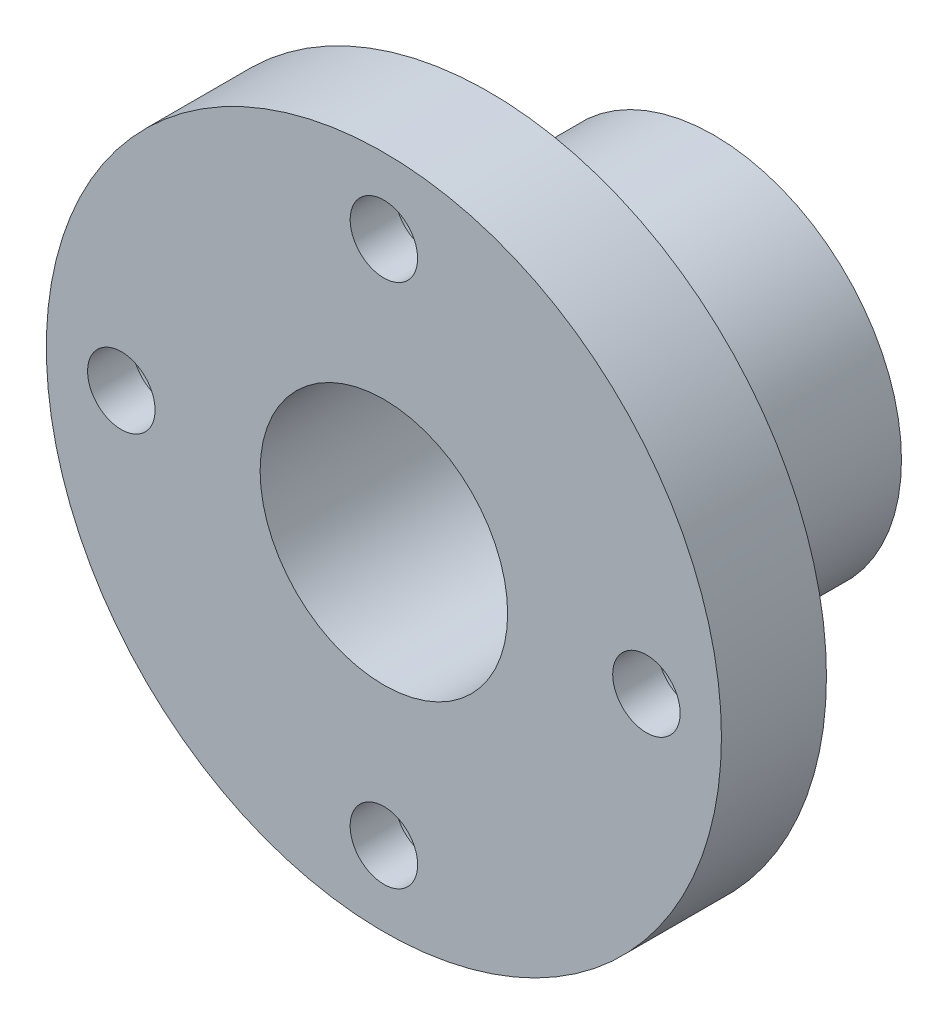
ISO-10303-21;
HEADER;
FILE_DESCRIPTION(('STEP AP214'),'2;1');
FILE_NAME('part.step','',(''),(''),'','','');
FILE_SCHEMA(('AUTOMOTIVE_DESIGN { 1 0 10303 214 1 1 1 1 }'));
ENDSEC;
DATA;
#1=APPLICATION_CONTEXT('core data for automotive mechanical design processes');
#2=APPLICATION_PROTOCOL_DEFINITION('international standard','automotive_design',2000,#1);
#3=PRODUCT_CONTEXT('',#1,'mechanical');
#4=PRODUCT('Part','Part','',(#3));
#5=PRODUCT_RELATED_PRODUCT_CATEGORY('part','',(#4));
#6=PRODUCT_DEFINITION_FORMATION('','',#4);
#7=PRODUCT_DEFINITION_CONTEXT('part definition',#1,'design');
#8=PRODUCT_DEFINITION('design','',#6,#7);
#9=PRODUCT_DEFINITION_SHAPE('','',#8);
#10=(LENGTH_UNIT() NAMED_UNIT(*) SI_UNIT(.MILLI.,.METRE.));
#11=(NAMED_UNIT(*) PLANE_ANGLE_UNIT() SI_UNIT($,.RADIAN.));
#12=(NAMED_UNIT(*) SI_UNIT($,.STERADIAN.) SOLID_ANGLE_UNIT());
#13=UNCERTAINTY_MEASURE_WITH_UNIT(LENGTH_MEASURE(1.E-05),#10,'distance_accuracy_value','');
#14=(GEOMETRIC_REPRESENTATION_CONTEXT(3) GLOBAL_UNCERTAINTY_ASSIGNED_CONTEXT((#13)) GLOBAL_UNIT_ASSIGNED_CONTEXT((#10,
#11,#12)) REPRESENTATION_CONTEXT('',''));
#15=CARTESIAN_POINT('',(0.,0.,0.));
#16=DIRECTION('',(0.,0.,1.));
#17=DIRECTION('',(1.,0.,0.));
#18=AXIS2_PLACEMENT_3D('',#15,#16,#17);
#19=CARTESIAN_POINT('',(0.,0.,15.));
#20=DIRECTION('',(0.,0.,-1.));
#21=DIRECTION('',(-1.,0.,0.));
#22=AXIS2_PLACEMENT_3D('',#19,#20,#21);
#23=CYLINDRICAL_SURFACE('',#22,12.5);
#24=CARTESIAN_POINT('',(0.,0.,15.));
#25=DIRECTION('',(0.,0.,1.));
#26=DIRECTION('',(1.,0.,0.));
#27=AXIS2_PLACEMENT_3D('',#24,#25,#26);
#28=CIRCLE('',#27,12.5);
#29=CARTESIAN_POINT('',(12.5,0.,15.));
#30=VERTEX_POINT('',#29);
#31=EDGE_CURVE('E10',#30,#30,#28,.T.);
#32=ORIENTED_EDGE('',*,*,#31,.F.);
#33=EDGE_LOOP('',(#32));
#34=FACE_BOUND('',#33,.T.);
#35=CARTESIAN_POINT('',(0.,0.,0.));
#36=DIRECTION('',(0.,0.,1.));
#37=DIRECTION('',(1.,0.,0.));
#38=AXIS2_PLACEMENT_3D('',#35,#36,#37);
#39=CIRCLE('',#38,12.5);
#40=CARTESIAN_POINT('',(12.5,0.,0.));
#41=VERTEX_POINT('',#40);
#42=EDGE_CURVE('E41',#41,#41,#39,.T.);
#43=ORIENTED_EDGE('',*,*,#42,.T.);
#44=EDGE_LOOP('',(#43));
#45=FACE_BOUND('',#44,.T.);
#46=ADVANCED_FACE('F34',(#34,#45),#23,.T.);
#47=CARTESIAN_POINT('',(0.,0.,0.));
#48=DIRECTION('',(0.,0.,1.));
#49=DIRECTION('',(1.,0.,0.));
#50=AXIS2_PLACEMENT_3D('',#47,#48,#49);
#51=PLANE('',#50);
#52=CARTESIAN_POINT('',(0.,0.,0.));
#53=DIRECTION('',(0.,0.,-1.));
#54=DIRECTION('',(-1.,0.,0.));
#55=AXIS2_PLACEMENT_3D('',#52,#53,#54);
#56=CIRCLE('',#55,8.25);
#57=CARTESIAN_POINT('',(-8.25,0.,0.));
#58=VERTEX_POINT('',#57);
#59=EDGE_CURVE('E53',#58,#58,#56,.T.);
#60=ORIENTED_EDGE('',*,*,#59,.F.);
#61=EDGE_LOOP('',(#60));
#62=FACE_BOUND('',#61,.T.);
#63=ORIENTED_EDGE('',*,*,#42,.F.);
#64=EDGE_LOOP('',(#63));
#65=FACE_BOUND('',#64,.T.);
#66=ADVANCED_FACE('F123',(#62,#65),#51,.F.);
#67=CARTESIAN_POINT('',(0.,0.,15.));
#68=DIRECTION('',(0.,0.,1.));
#69=DIRECTION('',(1.,0.,0.));
#70=AXIS2_PLACEMENT_3D('',#67,#68,#69);
#71=PLANE('',#70);
#72=CARTESIAN_POINT('',(-17.5,1.83302876458243E-13,15.));
#73=DIRECTION('',(0.,0.,-1.));
#74=DIRECTION('',(-1.,0.,0.));
#75=AXIS2_PLACEMENT_3D('',#72,#73,#74);
#76=CIRCLE('',#75,4.025);
#77=CARTESIAN_POINT('',(-21.525,1.83302876458243E-13,15.));
#78=VERTEX_POINT('',#77);
#79=EDGE_CURVE('E113',#78,#78,#76,.T.);
#80=ORIENTED_EDGE('',*,*,#79,.F.);
#81=EDGE_LOOP('',(#80));
#82=FACE_BOUND('',#81,.T.);
#83=CARTESIAN_POINT('',(-1.22201917638828E-13,-17.5,15.));
#84=DIRECTION('',(0.,0.,-1.));
#85=DIRECTION('',(-1.,0.,0.));
#86=AXIS2_PLACEMENT_3D('',#83,#84,#85);
#87=CIRCLE('',#86,4.025);
#88=CARTESIAN_POINT('',(-4.02500000000012,-17.5,15.));
#89=VERTEX_POINT('',#88);
#90=EDGE_CURVE('E98',#89,#89,#87,.T.);
#91=ORIENTED_EDGE('',*,*,#90,.F.);
#92=EDGE_LOOP('',(#91));
#93=FACE_BOUND('',#92,.T.);
#94=CARTESIAN_POINT('',(17.5,0.,15.));
#95=DIRECTION('',(0.,0.,-1.));
#96=DIRECTION('',(-1.,0.,0.));
#97=AXIS2_PLACEMENT_3D('',#94,#95,#96);
#98=CIRCLE('',#97,4.025);
#99=CARTESIAN_POINT('',(13.475,0.,15.));
#100=VERTEX_POINT('',#99);
#101=EDGE_CURVE('E83',#100,#100,#98,.T.);
#102=ORIENTED_EDGE('',*,*,#101,.F.);
#103=EDGE_LOOP('',(#102));
#104=FACE_BOUND('',#103,.T.);
#105=CARTESIAN_POINT('',(0.,17.5,15.));
#106=DIRECTION('',(0.,0.,-1.));
#107=DIRECTION('',(-1.,0.,0.));
#108=AXIS2_PLACEMENT_3D('',#105,#106,#107);
#109=CIRCLE('',#108,4.025);
#110=CARTESIAN_POINT('',(-4.025,17.5,15.));
#111=VERTEX_POINT('',#110);
#112=EDGE_CURVE('E68',#111,#111,#109,.T.);
#113=ORIENTED_EDGE('',*,*,#112,.F.);
#114=EDGE_LOOP('',(#113));
#115=FACE_BOUND('',#114,.T.);
#116=CARTESIAN_POINT('',(0.,0.,15.));
#117=DIRECTION('',(0.,0.,1.));
#118=DIRECTION('',(1.,0.,0.));
#119=AXIS2_PLACEMENT_3D('',#116,#117,#118);
#120=CIRCLE('',#119,22.5);
#121=CARTESIAN_POINT('',(22.5,0.,15.));
#122=VERTEX_POINT('',#121);
#123=EDGE_CURVE('E48',#122,#122,#120,.T.);
#124=ORIENTED_EDGE('',*,*,#123,.F.);
#125=EDGE_LOOP('',(#124));
#126=FACE_BOUND('',#125,.T.);
#127=ORIENTED_EDGE('',*,*,#31,.T.);
#128=EDGE_LOOP('',(#127));
#129=FACE_BOUND('',#128,.T.);
#130=ADVANCED_FACE('F119',(#82,#93,#104,#115,#126,#129),#71,.F.);
#131=CARTESIAN_POINT('',(0.,0.,22.));
#132=DIRECTION('',(0.,0.,-1.));
#133=DIRECTION('',(-1.,0.,0.));
#134=AXIS2_PLACEMENT_3D('',#131,#132,#133);
#135=CYLINDRICAL_SURFACE('',#134,22.5);
#136=CARTESIAN_POINT('',(0.,0.,22.));
#137=DIRECTION('',(0.,0.,1.));
#138=DIRECTION('',(1.,0.,0.));
#139=AXIS2_PLACEMENT_3D('',#136,#137,#138);
#140=CIRCLE('',#139,22.5);
#141=CARTESIAN_POINT('',(22.5,0.,22.));
#142=VERTEX_POINT('',#141);
#143=EDGE_CURVE('E46',#142,#142,#140,.T.);
#144=ORIENTED_EDGE('',*,*,#143,.F.);
#145=EDGE_LOOP('',(#144));
#146=FACE_BOUND('',#145,.T.);
#147=ORIENTED_EDGE('',*,*,#123,.T.);
#148=EDGE_LOOP('',(#147));
#149=FACE_BOUND('',#148,.T.);
#150=ADVANCED_FACE('F122',(#146,#149),#135,.T.);
#151=CARTESIAN_POINT('',(0.,0.,22.));
#152=DIRECTION('',(0.,0.,1.));
#153=DIRECTION('',(1.,0.,0.));
#154=AXIS2_PLACEMENT_3D('',#151,#152,#153);
#155=PLANE('',#154);
#156=CARTESIAN_POINT('',(-17.5,1.83302876458243E-13,22.));
#157=DIRECTION('',(0.,0.,-1.));
#158=DIRECTION('',(-1.,0.,0.));
#159=AXIS2_PLACEMENT_3D('',#156,#157,#158);
#160=CIRCLE('',#159,2.25);
#161=CARTESIAN_POINT('',(-19.75,1.83302876458243E-13,22.));
#162=VERTEX_POINT('',#161);
#163=EDGE_CURVE('E101',#162,#162,#160,.T.);
#164=ORIENTED_EDGE('',*,*,#163,.T.);
#165=EDGE_LOOP('',(#164));
#166=FACE_BOUND('',#165,.T.);
#167=CARTESIAN_POINT('',(-1.22201917638828E-13,-17.5,22.));
#168=DIRECTION('',(0.,0.,-1.));
#169=DIRECTION('',(-1.,0.,0.));
#170=AXIS2_PLACEMENT_3D('',#167,#168,#169);
#171=CIRCLE('',#170,2.25);
#172=CARTESIAN_POINT('',(-2.25000000000012,-17.5,22.));
#173=VERTEX_POINT('',#172);
#174=EDGE_CURVE('E86',#173,#173,#171,.T.);
#175=ORIENTED_EDGE('',*,*,#174,.T.);
#176=EDGE_LOOP('',(#175));
#177=FACE_BOUND('',#176,.T.);
#178=CARTESIAN_POINT('',(17.5,0.,22.));
#179=DIRECTION('',(0.,0.,-1.));
#180=DIRECTION('',(-1.,0.,0.));
#181=AXIS2_PLACEMENT_3D('',#178,#179,#180);
#182=CIRCLE('',#181,2.25);
#183=CARTESIAN_POINT('',(15.25,0.,22.));
#184=VERTEX_POINT('',#183);
#185=EDGE_CURVE('E71',#184,#184,#182,.T.);
#186=ORIENTED_EDGE('',*,*,#185,.T.);
#187=EDGE_LOOP('',(#186));
#188=FACE_BOUND('',#187,.T.);
#189=CARTESIAN_POINT('',(0.,17.5,22.));
#190=DIRECTION('',(0.,0.,-1.));
#191=DIRECTION('',(-1.,0.,0.));
#192=AXIS2_PLACEMENT_3D('',#189,#190,#191);
#193=CIRCLE('',#192,2.25);
#194=CARTESIAN_POINT('',(-2.25,17.5,22.));
#195=VERTEX_POINT('',#194);
#196=EDGE_CURVE('E56',#195,#195,#193,.T.);
#197=ORIENTED_EDGE('',*,*,#196,.T.);
#198=EDGE_LOOP('',(#197));
#199=FACE_BOUND('',#198,.T.);
#200=CARTESIAN_POINT('',(0.,0.,22.));
#201=DIRECTION('',(0.,0.,1.));
#202=DIRECTION('',(1.,0.,0.));
#203=AXIS2_PLACEMENT_3D('',#200,#201,#202);
#204=CIRCLE('',#203,8.24999999999999);
#205=CARTESIAN_POINT('',(8.24999999999999,0.,22.));
#206=VERTEX_POINT('',#205);
#207=EDGE_CURVE('E37',#206,#206,#204,.T.);
#208=ORIENTED_EDGE('',*,*,#207,.F.);
#209=EDGE_LOOP('',(#208));
#210=FACE_BOUND('',#209,.T.);
#211=ORIENTED_EDGE('',*,*,#143,.T.);
#212=EDGE_LOOP('',(#211));
#213=FACE_BOUND('',#212,.T.);
#214=ADVANCED_FACE('F134',(#166,#177,#188,#199,#210,#213),#155,.T.);
#215=CARTESIAN_POINT('',(0.,0.,0.));
#216=DIRECTION('',(0.,0.,-1.));
#217=DIRECTION('',(-1.,0.,0.));
#218=AXIS2_PLACEMENT_3D('',#215,#216,#217);
#219=CYLINDRICAL_SURFACE('',#218,8.24999999999999);
#220=ORIENTED_EDGE('',*,*,#207,.T.);
#221=EDGE_LOOP('',(#220));
#222=FACE_BOUND('',#221,.T.);
#223=ORIENTED_EDGE('',*,*,#59,.T.);
#224=EDGE_LOOP('',(#223));
#225=FACE_BOUND('',#224,.T.);
#226=ADVANCED_FACE('F140',(#222,#225),#219,.F.);
#227=CARTESIAN_POINT('',(0.,17.5,15.));
#228=DIRECTION('',(0.,0.,-1.));
#229=DIRECTION('',(-1.,0.,0.));
#230=AXIS2_PLACEMENT_3D('',#227,#228,#229);
#231=CYLINDRICAL_SURFACE('',#230,2.25);
#232=ORIENTED_EDGE('',*,*,#196,.F.);
#233=EDGE_LOOP('',(#232));
#234=FACE_BOUND('',#233,.T.);
#235=CARTESIAN_POINT('',(0.,17.5,19.));
#236=DIRECTION('',(0.,0.,-1.));
#237=DIRECTION('',(-1.,0.,0.));
#238=AXIS2_PLACEMENT_3D('',#235,#236,#237);
#239=CIRCLE('',#238,2.25);
#240=CARTESIAN_POINT('',(-2.25,17.5,19.));
#241=VERTEX_POINT('',#240);
#242=EDGE_CURVE('E59',#241,#241,#239,.T.);
#243=ORIENTED_EDGE('',*,*,#242,.T.);
#244=EDGE_LOOP('',(#243));
#245=FACE_BOUND('',#244,.T.);
#246=ADVANCED_FACE('F158',(#234,#245),#231,.F.);
#247=CARTESIAN_POINT('',(4.,17.5,19.));
#248=DIRECTION('',(0.,0.,1.));
#249=DIRECTION('',(1.,0.,0.));
#250=AXIS2_PLACEMENT_3D('',#247,#248,#249);
#251=PLANE('',#250);
#252=ORIENTED_EDGE('',*,*,#242,.F.);
#253=EDGE_LOOP('',(#252));
#254=FACE_BOUND('',#253,.T.);
#255=CARTESIAN_POINT('',(0.,17.5,19.));
#256=DIRECTION('',(0.,0.,-1.));
#257=DIRECTION('',(-1.,0.,0.));
#258=AXIS2_PLACEMENT_3D('',#255,#256,#257);
#259=CIRCLE('',#258,4.);
#260=CARTESIAN_POINT('',(-4.,17.5,19.));
#261=VERTEX_POINT('',#260);
#262=EDGE_CURVE('E62',#261,#261,#259,.T.);
#263=ORIENTED_EDGE('',*,*,#262,.T.);
#264=EDGE_LOOP('',(#263));
#265=FACE_BOUND('',#264,.T.);
#266=ADVANCED_FACE('F164',(#254,#265),#251,.F.);
#267=CARTESIAN_POINT('',(0.,17.5,15.));
#268=DIRECTION('',(0.,0.,-1.));
#269=DIRECTION('',(-1.,0.,0.));
#270=AXIS2_PLACEMENT_3D('',#267,#268,#269);
#271=CYLINDRICAL_SURFACE('',#270,4.);
#272=ORIENTED_EDGE('',*,*,#262,.F.);
#273=EDGE_LOOP('',(#272));
#274=FACE_BOUND('',#273,.T.);
#275=CARTESIAN_POINT('',(0.,17.5,15.025));
#276=DIRECTION('',(0.,0.,-1.));
#277=DIRECTION('',(-1.,0.,0.));
#278=AXIS2_PLACEMENT_3D('',#275,#276,#277);
#279=CIRCLE('',#278,4.);
#280=CARTESIAN_POINT('',(-4.,17.5,15.025));
#281=VERTEX_POINT('',#280);
#282=EDGE_CURVE('E65',#281,#281,#279,.T.);
#283=ORIENTED_EDGE('',*,*,#282,.T.);
#284=EDGE_LOOP('',(#283));
#285=FACE_BOUND('',#284,.T.);
#286=ADVANCED_FACE('F171',(#274,#285),#271,.F.);
#287=CARTESIAN_POINT('',(0.,17.5,15.));
#288=DIRECTION('',(0.,0.,-1.));
#289=DIRECTION('',(-1.,0.,0.));
#290=AXIS2_PLACEMENT_3D('',#287,#288,#289);
#291=CONICAL_SURFACE('',#290,4.025,0.785398163397448);
#292=ORIENTED_EDGE('',*,*,#282,.F.);
#293=EDGE_LOOP('',(#292));
#294=FACE_BOUND('',#293,.T.);
#295=ORIENTED_EDGE('',*,*,#112,.T.);
#296=EDGE_LOOP('',(#295));
#297=FACE_BOUND('',#296,.T.);
#298=ADVANCED_FACE('F175',(#294,#297),#291,.F.);
#299=CARTESIAN_POINT('',(17.5,0.,15.));
#300=DIRECTION('',(0.,0.,-1.));
#301=DIRECTION('',(-1.,0.,0.));
#302=AXIS2_PLACEMENT_3D('',#299,#300,#301);
#303=CYLINDRICAL_SURFACE('',#302,2.25);
#304=ORIENTED_EDGE('',*,*,#185,.F.);
#305=EDGE_LOOP('',(#304));
#306=FACE_BOUND('',#305,.T.);
#307=CARTESIAN_POINT('',(17.5,0.,19.));
#308=DIRECTION('',(0.,0.,-1.));
#309=DIRECTION('',(-1.,0.,0.));
#310=AXIS2_PLACEMENT_3D('',#307,#308,#309);
#311=CIRCLE('',#310,2.25);
#312=CARTESIAN_POINT('',(15.25,0.,19.));
#313=VERTEX_POINT('',#312);
#314=EDGE_CURVE('E74',#313,#313,#311,.T.);
#315=ORIENTED_EDGE('',*,*,#314,.T.);
#316=EDGE_LOOP('',(#315));
#317=FACE_BOUND('',#316,.T.);
#318=ADVANCED_FACE('F179',(#306,#317),#303,.F.);
#319=CARTESIAN_POINT('',(21.5,0.,19.));
#320=DIRECTION('',(0.,0.,1.));
#321=DIRECTION('',(1.,0.,0.));
#322=AXIS2_PLACEMENT_3D('',#319,#320,#321);
#323=PLANE('',#322);
#324=ORIENTED_EDGE('',*,*,#314,.F.);
#325=EDGE_LOOP('',(#324));
#326=FACE_BOUND('',#325,.T.);
#327=CARTESIAN_POINT('',(17.5,0.,19.));
#328=DIRECTION('',(0.,0.,-1.));
#329=DIRECTION('',(-1.,0.,0.));
#330=AXIS2_PLACEMENT_3D('',#327,#328,#329);
#331=CIRCLE('',#330,4.);
#332=CARTESIAN_POINT('',(13.5,0.,19.));
#333=VERTEX_POINT('',#332);
#334=EDGE_CURVE('E77',#333,#333,#331,.T.);
#335=ORIENTED_EDGE('',*,*,#334,.T.);
#336=EDGE_LOOP('',(#335));
#337=FACE_BOUND('',#336,.T.);
#338=ADVANCED_FACE('F183',(#326,#337),#323,.F.);
#339=CARTESIAN_POINT('',(17.5,0.,15.));
#340=DIRECTION('',(0.,0.,-1.));
#341=DIRECTION('',(-1.,0.,0.));
#342=AXIS2_PLACEMENT_3D('',#339,#340,#341);
#343=CYLINDRICAL_SURFACE('',#342,4.);
#344=ORIENTED_EDGE('',*,*,#334,.F.);
#345=EDGE_LOOP('',(#344));
#346=FACE_BOUND('',#345,.T.);
#347=CARTESIAN_POINT('',(17.5,0.,15.025));
#348=DIRECTION('',(0.,0.,-1.));
#349=DIRECTION('',(-1.,0.,0.));
#350=AXIS2_PLACEMENT_3D('',#347,#348,#349);
#351=CIRCLE('',#350,4.);
#352=CARTESIAN_POINT('',(13.5,0.,15.025));
#353=VERTEX_POINT('',#352);
#354=EDGE_CURVE('E80',#353,#353,#351,.T.);
#355=ORIENTED_EDGE('',*,*,#354,.T.);
#356=EDGE_LOOP('',(#355));
#357=FACE_BOUND('',#356,.T.);
#358=ADVANCED_FACE('F187',(#346,#357),#343,.F.);
#359=CARTESIAN_POINT('',(17.5,0.,15.));
#360=DIRECTION('',(0.,0.,-1.));
#361=DIRECTION('',(-1.,0.,0.));
#362=AXIS2_PLACEMENT_3D('',#359,#360,#361);
#363=CONICAL_SURFACE('',#362,4.025,0.785398163397483);
#364=ORIENTED_EDGE('',*,*,#354,.F.);
#365=EDGE_LOOP('',(#364));
#366=FACE_BOUND('',#365,.T.);
#367=ORIENTED_EDGE('',*,*,#101,.T.);
#368=EDGE_LOOP('',(#367));
#369=FACE_BOUND('',#368,.T.);
#370=ADVANCED_FACE('F191',(#366,#369),#363,.F.);
#371=CARTESIAN_POINT('',(-1.22201917638828E-13,-17.5,15.));
#372=DIRECTION('',(0.,0.,-1.));
#373=DIRECTION('',(-1.,0.,0.));
#374=AXIS2_PLACEMENT_3D('',#371,#372,#373);
#375=CYLINDRICAL_SURFACE('',#374,2.25);
#376=ORIENTED_EDGE('',*,*,#174,.F.);
#377=EDGE_LOOP('',(#376));
#378=FACE_BOUND('',#377,.T.);
#379=CARTESIAN_POINT('',(-1.22201917638828E-13,-17.5,19.));
#380=DIRECTION('',(0.,0.,-1.));
#381=DIRECTION('',(-1.,0.,0.));
#382=AXIS2_PLACEMENT_3D('',#379,#380,#381);
#383=CIRCLE('',#382,2.25);
#384=CARTESIAN_POINT('',(-2.25000000000012,-17.5,19.));
#385=VERTEX_POINT('',#384);
#386=EDGE_CURVE('E89',#385,#385,#383,.T.);
#387=ORIENTED_EDGE('',*,*,#386,.T.);
#388=EDGE_LOOP('',(#387));
#389=FACE_BOUND('',#388,.T.);
#390=ADVANCED_FACE('F195',(#378,#389),#375,.F.);
#391=CARTESIAN_POINT('',(3.99999999999988,-17.5,19.));
#392=DIRECTION('',(0.,0.,1.));
#393=DIRECTION('',(1.,0.,0.));
#394=AXIS2_PLACEMENT_3D('',#391,#392,#393);
#395=PLANE('',#394);
#396=ORIENTED_EDGE('',*,*,#386,.F.);
#397=EDGE_LOOP('',(#396));
#398=FACE_BOUND('',#397,.T.);
#399=CARTESIAN_POINT('',(-1.22201917638828E-13,-17.5,19.));
#400=DIRECTION('',(0.,0.,-1.));
#401=DIRECTION('',(-1.,0.,0.));
#402=AXIS2_PLACEMENT_3D('',#399,#400,#401);
#403=CIRCLE('',#402,4.);
#404=CARTESIAN_POINT('',(-4.00000000000012,-17.5,19.));
#405=VERTEX_POINT('',#404);
#406=EDGE_CURVE('E92',#405,#405,#403,.T.);
#407=ORIENTED_EDGE('',*,*,#406,.T.);
#408=EDGE_LOOP('',(#407));
#409=FACE_BOUND('',#408,.T.);
#410=ADVANCED_FACE('F199',(#398,#409),#395,.F.);
#411=CARTESIAN_POINT('',(-1.22201917638828E-13,-17.5,15.));
#412=DIRECTION('',(0.,0.,-1.));
#413=DIRECTION('',(-1.,0.,0.));
#414=AXIS2_PLACEMENT_3D('',#411,#412,#413);
#415=CYLINDRICAL_SURFACE('',#414,4.);
#416=ORIENTED_EDGE('',*,*,#406,.F.);
#417=EDGE_LOOP('',(#416));
#418=FACE_BOUND('',#417,.T.);
#419=CARTESIAN_POINT('',(-1.22201917638828E-13,-17.5,15.025));
#420=DIRECTION('',(0.,0.,-1.));
#421=DIRECTION('',(-1.,0.,0.));
#422=AXIS2_PLACEMENT_3D('',#419,#420,#421);
#423=CIRCLE('',#422,4.);
#424=CARTESIAN_POINT('',(-4.00000000000012,-17.5,15.025));
#425=VERTEX_POINT('',#424);
#426=EDGE_CURVE('E95',#425,#425,#423,.T.);
#427=ORIENTED_EDGE('',*,*,#426,.T.);
#428=EDGE_LOOP('',(#427));
#429=FACE_BOUND('',#428,.T.);
#430=ADVANCED_FACE('F203',(#418,#429),#415,.F.);
#431=CARTESIAN_POINT('',(-1.22201917638828E-13,-17.5,15.));
#432=DIRECTION('',(0.,0.,-1.));
#433=DIRECTION('',(-1.,0.,0.));
#434=AXIS2_PLACEMENT_3D('',#431,#432,#433);
#435=CONICAL_SURFACE('',#434,4.025,0.785398163397448);
#436=ORIENTED_EDGE('',*,*,#426,.F.);
#437=EDGE_LOOP('',(#436));
#438=FACE_BOUND('',#437,.T.);
#439=ORIENTED_EDGE('',*,*,#90,.T.);
#440=EDGE_LOOP('',(#439));
#441=FACE_BOUND('',#440,.T.);
#442=ADVANCED_FACE('F207',(#438,#441),#435,.F.);
#443=CARTESIAN_POINT('',(-17.5,1.83302876458243E-13,15.));
#444=DIRECTION('',(0.,0.,-1.));
#445=DIRECTION('',(-1.,0.,0.));
#446=AXIS2_PLACEMENT_3D('',#443,#444,#445);
#447=CYLINDRICAL_SURFACE('',#446,2.25);
#448=ORIENTED_EDGE('',*,*,#163,.F.);
#449=EDGE_LOOP('',(#448));
#450=FACE_BOUND('',#449,.T.);
#451=CARTESIAN_POINT('',(-17.5,1.83302876458243E-13,19.));
#452=DIRECTION('',(0.,0.,-1.));
#453=DIRECTION('',(-1.,0.,0.));
#454=AXIS2_PLACEMENT_3D('',#451,#452,#453);
#455=CIRCLE('',#454,2.25);
#456=CARTESIAN_POINT('',(-19.75,1.83302876458243E-13,19.));
#457=VERTEX_POINT('',#456);
#458=EDGE_CURVE('E104',#457,#457,#455,.T.);
#459=ORIENTED_EDGE('',*,*,#458,.T.);
#460=EDGE_LOOP('',(#459));
#461=FACE_BOUND('',#460,.T.);
#462=ADVANCED_FACE('F211',(#450,#461),#447,.F.);
#463=CARTESIAN_POINT('',(-13.5,1.83302876458243E-13,19.));
#464=DIRECTION('',(0.,0.,1.));
#465=DIRECTION('',(1.,0.,0.));
#466=AXIS2_PLACEMENT_3D('',#463,#464,#465);
#467=PLANE('',#466);
#468=ORIENTED_EDGE('',*,*,#458,.F.);
#469=EDGE_LOOP('',(#468));
#470=FACE_BOUND('',#469,.T.);
#471=CARTESIAN_POINT('',(-17.5,1.83302876458243E-13,19.));
#472=DIRECTION('',(0.,0.,-1.));
#473=DIRECTION('',(-1.,0.,0.));
#474=AXIS2_PLACEMENT_3D('',#471,#472,#473);
#475=CIRCLE('',#474,4.);
#476=CARTESIAN_POINT('',(-21.5,1.83302876458243E-13,19.));
#477=VERTEX_POINT('',#476);
#478=EDGE_CURVE('E107',#477,#477,#475,.T.);
#479=ORIENTED_EDGE('',*,*,#478,.T.);
#480=EDGE_LOOP('',(#479));
#481=FACE_BOUND('',#480,.T.);
#482=ADVANCED_FACE('F215',(#470,#481),#467,.F.);
#483=CARTESIAN_POINT('',(-17.5,1.83302876458243E-13,15.));
#484=DIRECTION('',(0.,0.,-1.));
#485=DIRECTION('',(-1.,0.,0.));
#486=AXIS2_PLACEMENT_3D('',#483,#484,#485);
#487=CYLINDRICAL_SURFACE('',#486,4.);
#488=ORIENTED_EDGE('',*,*,#478,.F.);
#489=EDGE_LOOP('',(#488));
#490=FACE_BOUND('',#489,.T.);
#491=CARTESIAN_POINT('',(-17.5,1.83302876458243E-13,15.025));
#492=DIRECTION('',(0.,0.,-1.));
#493=DIRECTION('',(-1.,0.,0.));
#494=AXIS2_PLACEMENT_3D('',#491,#492,#493);
#495=CIRCLE('',#494,4.);
#496=CARTESIAN_POINT('',(-21.5,1.83302876458243E-13,15.025));
#497=VERTEX_POINT('',#496);
#498=EDGE_CURVE('E110',#497,#497,#495,.T.);
#499=ORIENTED_EDGE('',*,*,#498,.T.);
#500=EDGE_LOOP('',(#499));
#501=FACE_BOUND('',#500,.T.);
#502=ADVANCED_FACE('F219',(#490,#501),#487,.F.);
#503=CARTESIAN_POINT('',(-17.5,1.83302876458243E-13,15.));
#504=DIRECTION('',(0.,0.,-1.));
#505=DIRECTION('',(-1.,0.,0.));
#506=AXIS2_PLACEMENT_3D('',#503,#504,#505);
#507=CONICAL_SURFACE('',#506,4.025,0.785398163397448);
#508=ORIENTED_EDGE('',*,*,#498,.F.);
#509=EDGE_LOOP('',(#508));
#510=FACE_BOUND('',#509,.T.);
#511=ORIENTED_EDGE('',*,*,#79,.T.);
#512=EDGE_LOOP('',(#511));
#513=FACE_BOUND('',#512,.T.);
#514=ADVANCED_FACE('F117',(#510,#513),#507,.F.);
#515=CLOSED_SHELL('',(#46,#66,#130,#150,#214,#226,#246,#266,#286,#298,#318,#338,#358,#370,#390,
#410,#430,#442,#462,#482,#502,#514));
#516=MANIFOLD_SOLID_BREP('B2',#515);
#517=ADVANCED_BREP_SHAPE_REPRESENTATION('',(#18,#516),#14);
#518=SHAPE_DEFINITION_REPRESENTATION(#9,#517);
ENDSEC;
END-ISO-10303-21;
